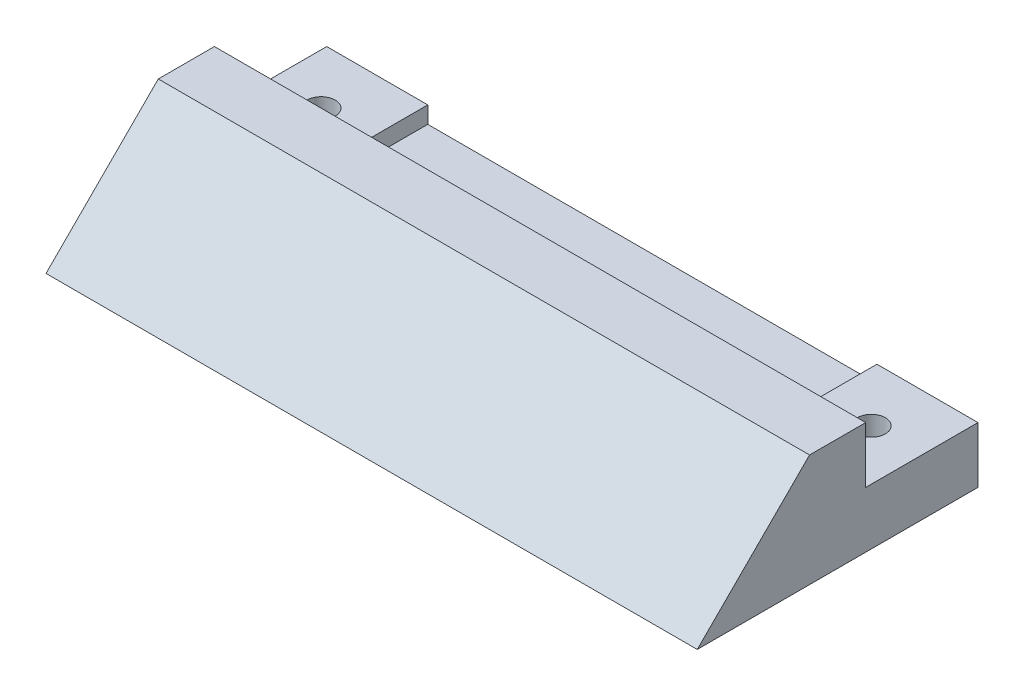
ISO-10303-21;
HEADER;
FILE_DESCRIPTION(('STEP AP214'),'2;1');
FILE_NAME('part.step','',(''),(''),'','','');
FILE_SCHEMA(('AUTOMOTIVE_DESIGN { 1 0 10303 214 1 1 1 1 }'));
ENDSEC;
DATA;
#1=APPLICATION_CONTEXT('core data for automotive mechanical design processes');
#2=APPLICATION_PROTOCOL_DEFINITION('international standard','automotive_design',2000,#1);
#3=PRODUCT_CONTEXT('',#1,'mechanical');
#4=PRODUCT('Part','Part','',(#3));
#5=PRODUCT_RELATED_PRODUCT_CATEGORY('part','',(#4));
#6=PRODUCT_DEFINITION_FORMATION('','',#4);
#7=PRODUCT_DEFINITION_CONTEXT('part definition',#1,'design');
#8=PRODUCT_DEFINITION('design','',#6,#7);
#9=PRODUCT_DEFINITION_SHAPE('','',#8);
#10=(LENGTH_UNIT() NAMED_UNIT(*) SI_UNIT(.MILLI.,.METRE.));
#11=(NAMED_UNIT(*) PLANE_ANGLE_UNIT() SI_UNIT($,.RADIAN.));
#12=(NAMED_UNIT(*) SI_UNIT($,.STERADIAN.) SOLID_ANGLE_UNIT());
#13=UNCERTAINTY_MEASURE_WITH_UNIT(LENGTH_MEASURE(1.E-05),#10,'distance_accuracy_value','');
#14=(GEOMETRIC_REPRESENTATION_CONTEXT(3) GLOBAL_UNCERTAINTY_ASSIGNED_CONTEXT((#13)) GLOBAL_UNIT_ASSIGNED_CONTEXT((#10,
#11,#12)) REPRESENTATION_CONTEXT('',''));
#15=CARTESIAN_POINT('',(0.,0.,0.));
#16=DIRECTION('',(0.,0.,1.));
#17=DIRECTION('',(1.,0.,0.));
#18=AXIS2_PLACEMENT_3D('',#15,#16,#17);
#19=CARTESIAN_POINT('',(58.,10.,-25.0000000000001));
#20=DIRECTION('',(0.,0.,1.));
#21=DIRECTION('',(0.,-1.,0.));
#22=AXIS2_PLACEMENT_3D('',#19,#20,#21);
#23=PLANE('',#22);
#24=DIRECTION('',(1.,0.,0.));
#25=VECTOR('',#24,1.);
#26=CARTESIAN_POINT('',(0.,5.,-25.0000000000001));
#27=LINE('',#26,#25);
#28=CARTESIAN_POINT('',(49.,5.,-25.0000000000001));
#29=VERTEX_POINT('',#28);
#30=CARTESIAN_POINT('',(58.,5.,-25.0000000000001));
#31=VERTEX_POINT('',#30);
#32=EDGE_CURVE('E232',#29,#31,#27,.T.);
#33=ORIENTED_EDGE('',*,*,#32,.T.);
#34=DIRECTION('',(0.,1.,0.));
#35=VECTOR('',#34,1.);
#36=CARTESIAN_POINT('',(58.,10.,-25.0000000000001));
#37=LINE('',#36,#35);
#38=CARTESIAN_POINT('',(58.,0.,-25.0000000000001));
#39=VERTEX_POINT('',#38);
#40=EDGE_CURVE('E218',#39,#31,#37,.T.);
#41=ORIENTED_EDGE('',*,*,#40,.F.);
#42=DIRECTION('',(-1.,0.,0.));
#43=VECTOR('',#42,1.);
#44=CARTESIAN_POINT('',(58.,0.,-25.0000000000001));
#45=LINE('',#44,#43);
#46=CARTESIAN_POINT('',(0.,0.,-25.0000000000001));
#47=VERTEX_POINT('',#46);
#48=EDGE_CURVE('E165',#39,#47,#45,.T.);
#49=ORIENTED_EDGE('',*,*,#48,.T.);
#50=DIRECTION('',(0.,1.,0.));
#51=VECTOR('',#50,1.);
#52=CARTESIAN_POINT('',(0.,10.,-25.0000000000001));
#53=LINE('',#52,#51);
#54=CARTESIAN_POINT('',(0.,5.,-25.0000000000001));
#55=VERTEX_POINT('',#54);
#56=EDGE_CURVE('E150',#47,#55,#53,.T.);
#57=ORIENTED_EDGE('',*,*,#56,.T.);
#58=CARTESIAN_POINT('',(9.,5.,-25.0000000000001));
#59=VERTEX_POINT('',#58);
#60=EDGE_CURVE('E425',#55,#59,#27,.T.);
#61=ORIENTED_EDGE('',*,*,#60,.T.);
#62=DIRECTION('',(0.,1.,0.));
#63=VECTOR('',#62,1.);
#64=CARTESIAN_POINT('',(9.,3.5,-25.0000000000001));
#65=LINE('',#64,#63);
#66=CARTESIAN_POINT('',(9.,3.5,-25.0000000000001));
#67=VERTEX_POINT('',#66);
#68=EDGE_CURVE('E211',#67,#59,#65,.T.);
#69=ORIENTED_EDGE('',*,*,#68,.F.);
#70=DIRECTION('',(-1.,0.,0.));
#71=VECTOR('',#70,1.);
#72=CARTESIAN_POINT('',(9.,3.5,-25.0000000000001));
#73=LINE('',#72,#71);
#74=CARTESIAN_POINT('',(49.,3.5,-25.0000000000001));
#75=VERTEX_POINT('',#74);
#76=EDGE_CURVE('E203',#75,#67,#73,.T.);
#77=ORIENTED_EDGE('',*,*,#76,.F.);
#78=DIRECTION('',(0.,1.,0.));
#79=VECTOR('',#78,1.);
#80=CARTESIAN_POINT('',(49.,3.5,-25.0000000000001));
#81=LINE('',#80,#79);
#82=EDGE_CURVE('E209',#75,#29,#81,.T.);
#83=ORIENTED_EDGE('',*,*,#82,.T.);
#84=EDGE_LOOP('',(#33,#41,#49,#57,#61,#69,#77,#83));
#85=FACE_BOUND('',#84,.T.);
#86=ADVANCED_FACE('F36',(#85),#23,.F.);
#87=CARTESIAN_POINT('',(9.,3.5,-25.0000000000001));
#88=DIRECTION('',(-1.,0.,0.));
#89=DIRECTION('',(0.,0.,1.));
#90=AXIS2_PLACEMENT_3D('',#87,#88,#89);
#91=PLANE('',#90);
#92=DIRECTION('',(0.,0.,-1.));
#93=VECTOR('',#92,1.);
#94=CARTESIAN_POINT('',(9.,5.,-25.0000000000001));
#95=LINE('',#94,#93);
#96=CARTESIAN_POINT('',(9.,5.,-18.0000000000001));
#97=VERTEX_POINT('',#96);
#98=EDGE_CURVE('E431',#97,#59,#95,.T.);
#99=ORIENTED_EDGE('',*,*,#98,.F.);
#100=DIRECTION('',(0.,1.,0.));
#101=VECTOR('',#100,1.);
#102=CARTESIAN_POINT('',(9.,3.5,-18.0000000000001));
#103=LINE('',#102,#101);
#104=CARTESIAN_POINT('',(9.,3.5,-18.0000000000001));
#105=VERTEX_POINT('',#104);
#106=EDGE_CURVE('E56',#97,#105,#103,.F.);
#107=ORIENTED_EDGE('',*,*,#106,.T.);
#108=DIRECTION('',(0.,0.,1.));
#109=VECTOR('',#108,1.);
#110=CARTESIAN_POINT('',(9.,3.5,-25.0000000000001));
#111=LINE('',#110,#109);
#112=EDGE_CURVE('E132',#67,#105,#111,.T.);
#113=ORIENTED_EDGE('',*,*,#112,.F.);
#114=ORIENTED_EDGE('',*,*,#68,.T.);
#115=EDGE_LOOP('',(#99,#107,#113,#114));
#116=FACE_BOUND('',#115,.T.);
#117=ADVANCED_FACE('F248',(#116),#91,.F.);
#118=CARTESIAN_POINT('',(49.,3.5,-25.0000000000001));
#119=DIRECTION('',(1.,0.,0.));
#120=DIRECTION('',(0.,0.,-1.));
#121=AXIS2_PLACEMENT_3D('',#118,#119,#120);
#122=PLANE('',#121);
#123=DIRECTION('',(0.,0.,-1.));
#124=VECTOR('',#123,1.);
#125=CARTESIAN_POINT('',(49.,3.5,-25.0000000000001));
#126=LINE('',#125,#124);
#127=CARTESIAN_POINT('',(49.,3.5,-18.0000000000001));
#128=VERTEX_POINT('',#127);
#129=EDGE_CURVE('E201',#128,#75,#126,.T.);
#130=ORIENTED_EDGE('',*,*,#129,.F.);
#131=DIRECTION('',(0.,1.,0.));
#132=VECTOR('',#131,1.);
#133=CARTESIAN_POINT('',(49.,5.,-18.0000000000001));
#134=LINE('',#133,#132);
#135=CARTESIAN_POINT('',(49.,5.,-18.0000000000001));
#136=VERTEX_POINT('',#135);
#137=EDGE_CURVE('E168',#128,#136,#134,.T.);
#138=ORIENTED_EDGE('',*,*,#137,.T.);
#139=DIRECTION('',(0.,0.,1.));
#140=VECTOR('',#139,1.);
#141=CARTESIAN_POINT('',(49.,5.,-25.0000000000001));
#142=LINE('',#141,#140);
#143=EDGE_CURVE('E188',#29,#136,#142,.T.);
#144=ORIENTED_EDGE('',*,*,#143,.F.);
#145=ORIENTED_EDGE('',*,*,#82,.F.);
#146=EDGE_LOOP('',(#130,#138,#144,#145));
#147=FACE_BOUND('',#146,.T.);
#148=ADVANCED_FACE('F253',(#147),#122,.F.);
#149=CARTESIAN_POINT('',(58.,0.,-25.0000000000001));
#150=DIRECTION('',(0.,1.,0.));
#151=DIRECTION('',(0.,0.,1.));
#152=AXIS2_PLACEMENT_3D('',#149,#150,#151);
#153=PLANE('',#152);
#154=CARTESIAN_POINT('',(53.5,0.,-20.0000000000001));
#155=DIRECTION('',(0.,1.,0.));
#156=DIRECTION('',(0.,0.,1.));
#157=AXIS2_PLACEMENT_3D('',#154,#155,#156);
#158=CIRCLE('',#157,1.25);
#159=CARTESIAN_POINT('',(53.5,0.,-18.7500000000001));
#160=VERTEX_POINT('',#159);
#161=EDGE_CURVE('E413',#160,#160,#158,.F.);
#162=ORIENTED_EDGE('',*,*,#161,.F.);
#163=EDGE_LOOP('',(#162));
#164=FACE_BOUND('',#163,.T.);
#165=CARTESIAN_POINT('',(4.5,0.,-20.0000000000001));
#166=DIRECTION('',(0.,1.,0.));
#167=DIRECTION('',(0.,0.,1.));
#168=AXIS2_PLACEMENT_3D('',#165,#166,#167);
#169=CIRCLE('',#168,1.25);
#170=CARTESIAN_POINT('',(4.5,0.,-18.7500000000001));
#171=VERTEX_POINT('',#170);
#172=EDGE_CURVE('E144',#171,#171,#169,.F.);
#173=ORIENTED_EDGE('',*,*,#172,.F.);
#174=EDGE_LOOP('',(#173));
#175=FACE_BOUND('',#174,.T.);
#176=CARTESIAN_POINT('',(44.,0.,-20.0000000000001));
#177=DIRECTION('',(0.,1.,0.));
#178=DIRECTION('',(0.,0.,1.));
#179=AXIS2_PLACEMENT_3D('',#176,#177,#178);
#180=CIRCLE('',#179,1.25);
#181=CARTESIAN_POINT('',(44.,0.,-18.7500000000001));
#182=VERTEX_POINT('',#181);
#183=EDGE_CURVE('E436',#182,#182,#180,.F.);
#184=ORIENTED_EDGE('',*,*,#183,.F.);
#185=EDGE_LOOP('',(#184));
#186=FACE_BOUND('',#185,.T.);
#187=CARTESIAN_POINT('',(29.,0.,-20.0000000000001));
#188=DIRECTION('',(0.,1.,0.));
#189=DIRECTION('',(0.,0.,1.));
#190=AXIS2_PLACEMENT_3D('',#187,#188,#189);
#191=CIRCLE('',#190,1.25);
#192=CARTESIAN_POINT('',(29.,0.,-18.7500000000001));
#193=VERTEX_POINT('',#192);
#194=EDGE_CURVE('E442',#193,#193,#191,.F.);
#195=ORIENTED_EDGE('',*,*,#194,.F.);
#196=EDGE_LOOP('',(#195));
#197=FACE_BOUND('',#196,.T.);
#198=CARTESIAN_POINT('',(14.,0.,-20.0000000000001));
#199=DIRECTION('',(0.,1.,0.));
#200=DIRECTION('',(0.,0.,1.));
#201=AXIS2_PLACEMENT_3D('',#198,#199,#200);
#202=CIRCLE('',#201,1.25);
#203=CARTESIAN_POINT('',(14.,0.,-18.7500000000001));
#204=VERTEX_POINT('',#203);
#205=EDGE_CURVE('E133',#204,#204,#202,.F.);
#206=ORIENTED_EDGE('',*,*,#205,.F.);
#207=EDGE_LOOP('',(#206));
#208=FACE_BOUND('',#207,.T.);
#209=DIRECTION('',(0.,0.,-1.));
#210=VECTOR('',#209,1.);
#211=CARTESIAN_POINT('',(0.,0.,-25.0000000000001));
#212=LINE('',#211,#210);
#213=CARTESIAN_POINT('',(0.,0.,0.));
#214=VERTEX_POINT('',#213);
#215=EDGE_CURVE('E155',#214,#47,#212,.T.);
#216=ORIENTED_EDGE('',*,*,#215,.T.);
#217=ORIENTED_EDGE('',*,*,#48,.F.);
#218=DIRECTION('',(0.,0.,-1.));
#219=VECTOR('',#218,1.);
#220=CARTESIAN_POINT('',(58.,0.,-25.0000000000001));
#221=LINE('',#220,#219);
#222=CARTESIAN_POINT('',(58.,0.,0.));
#223=VERTEX_POINT('',#222);
#224=EDGE_CURVE('E152',#223,#39,#221,.T.);
#225=ORIENTED_EDGE('',*,*,#224,.F.);
#226=DIRECTION('',(-1.,0.,0.));
#227=VECTOR('',#226,1.);
#228=CARTESIAN_POINT('',(58.,0.,0.));
#229=LINE('',#228,#227);
#230=EDGE_CURVE('E159',#223,#214,#229,.T.);
#231=ORIENTED_EDGE('',*,*,#230,.T.);
#232=EDGE_LOOP('',(#216,#217,#225,#231));
#233=FACE_BOUND('',#232,.T.);
#234=ADVANCED_FACE('F225',(#164,#175,#186,#197,#208,#233),#153,.F.);
#235=CARTESIAN_POINT('',(58.,10.,-10.0000000000001));
#236=DIRECTION('',(0.,-1.,0.));
#237=DIRECTION('',(0.,0.,-1.));
#238=AXIS2_PLACEMENT_3D('',#235,#236,#237);
#239=PLANE('',#238);
#240=DIRECTION('',(0.,0.,1.));
#241=VECTOR('',#240,1.);
#242=CARTESIAN_POINT('',(58.,10.,-10.0000000000001));
#243=LINE('',#242,#241);
#244=CARTESIAN_POINT('',(58.,10.,-15.0000000000001));
#245=VERTEX_POINT('',#244);
#246=CARTESIAN_POINT('',(58.,10.,-10.0000000000001));
#247=VERTEX_POINT('',#246);
#248=EDGE_CURVE('E129',#245,#247,#243,.T.);
#249=ORIENTED_EDGE('',*,*,#248,.F.);
#250=DIRECTION('',(1.,0.,0.));
#251=VECTOR('',#250,1.);
#252=CARTESIAN_POINT('',(9.,10.,-15.0000000000001));
#253=LINE('',#252,#251);
#254=CARTESIAN_POINT('',(0.,10.,-15.0000000000001));
#255=VERTEX_POINT('',#254);
#256=EDGE_CURVE('E122',#255,#245,#253,.T.);
#257=ORIENTED_EDGE('',*,*,#256,.F.);
#258=DIRECTION('',(0.,0.,1.));
#259=VECTOR('',#258,1.);
#260=CARTESIAN_POINT('',(0.,10.,-10.0000000000001));
#261=LINE('',#260,#259);
#262=CARTESIAN_POINT('',(0.,10.,-10.0000000000001));
#263=VERTEX_POINT('',#262);
#264=EDGE_CURVE('E127',#255,#263,#261,.T.);
#265=ORIENTED_EDGE('',*,*,#264,.T.);
#266=DIRECTION('',(-1.,0.,0.));
#267=VECTOR('',#266,1.);
#268=CARTESIAN_POINT('',(58.,10.,-10.0000000000001));
#269=LINE('',#268,#267);
#270=EDGE_CURVE('E162',#247,#263,#269,.T.);
#271=ORIENTED_EDGE('',*,*,#270,.F.);
#272=EDGE_LOOP('',(#249,#257,#265,#271));
#273=FACE_BOUND('',#272,.T.);
#274=ADVANCED_FACE('F124',(#273),#239,.F.);
#275=CARTESIAN_POINT('',(58.,0.,0.));
#276=DIRECTION('',(0.,-0.707106781186551,-0.707106781186544));
#277=DIRECTION('',(0.,0.707106781186544,-0.707106781186551));
#278=AXIS2_PLACEMENT_3D('',#275,#276,#277);
#279=PLANE('',#278);
#280=DIRECTION('',(0.,-0.707106781186544,0.707106781186551));
#281=VECTOR('',#280,1.);
#282=CARTESIAN_POINT('',(0.,0.,0.));
#283=LINE('',#282,#281);
#284=EDGE_CURVE('E149',#263,#214,#283,.T.);
#285=ORIENTED_EDGE('',*,*,#284,.T.);
#286=ORIENTED_EDGE('',*,*,#230,.F.);
#287=DIRECTION('',(0.,-0.707106781186544,0.707106781186551));
#288=VECTOR('',#287,1.);
#289=CARTESIAN_POINT('',(58.,0.,0.));
#290=LINE('',#289,#288);
#291=EDGE_CURVE('E163',#247,#223,#290,.T.);
#292=ORIENTED_EDGE('',*,*,#291,.F.);
#293=ORIENTED_EDGE('',*,*,#270,.T.);
#294=EDGE_LOOP('',(#285,#286,#292,#293));
#295=FACE_BOUND('',#294,.T.);
#296=ADVANCED_FACE('F237',(#295),#279,.F.);
#297=CARTESIAN_POINT('',(58.,0.,0.));
#298=DIRECTION('',(1.,0.,0.));
#299=DIRECTION('',(0.,0.,-1.));
#300=AXIS2_PLACEMENT_3D('',#297,#298,#299);
#301=PLANE('',#300);
#302=DIRECTION('',(0.,1.,0.));
#303=VECTOR('',#302,1.);
#304=CARTESIAN_POINT('',(58.,-55.3557558782486,-15.0000000000001));
#305=LINE('',#304,#303);
#306=CARTESIAN_POINT('',(58.,5.,-15.0000000000001));
#307=VERTEX_POINT('',#306);
#308=EDGE_CURVE('E143',#307,#245,#305,.T.);
#309=ORIENTED_EDGE('',*,*,#308,.T.);
#310=ORIENTED_EDGE('',*,*,#248,.T.);
#311=ORIENTED_EDGE('',*,*,#291,.T.);
#312=ORIENTED_EDGE('',*,*,#224,.T.);
#313=ORIENTED_EDGE('',*,*,#40,.T.);
#314=DIRECTION('',(0.,0.,1.));
#315=VECTOR('',#314,1.);
#316=CARTESIAN_POINT('',(58.,5.,-25.0000000000001));
#317=LINE('',#316,#315);
#318=EDGE_CURVE('E423',#31,#307,#317,.T.);
#319=ORIENTED_EDGE('',*,*,#318,.T.);
#320=EDGE_LOOP('',(#309,#310,#311,#312,#313,#319));
#321=FACE_BOUND('',#320,.T.);
#322=ADVANCED_FACE('F234',(#321),#301,.T.);
#323=CARTESIAN_POINT('',(0.,0.,0.));
#324=DIRECTION('',(1.,0.,0.));
#325=DIRECTION('',(0.,0.,-1.));
#326=AXIS2_PLACEMENT_3D('',#323,#324,#325);
#327=PLANE('',#326);
#328=ORIENTED_EDGE('',*,*,#264,.F.);
#329=DIRECTION('',(0.,1.,0.));
#330=VECTOR('',#329,1.);
#331=CARTESIAN_POINT('',(0.,-55.3557558782486,-15.0000000000001));
#332=LINE('',#331,#330);
#333=CARTESIAN_POINT('',(0.,5.,-15.0000000000001));
#334=VERTEX_POINT('',#333);
#335=EDGE_CURVE('E136',#334,#255,#332,.T.);
#336=ORIENTED_EDGE('',*,*,#335,.F.);
#337=DIRECTION('',(0.,0.,-1.));
#338=VECTOR('',#337,1.);
#339=CARTESIAN_POINT('',(0.,5.,-25.0000000000001));
#340=LINE('',#339,#338);
#341=EDGE_CURVE('E228',#334,#55,#340,.T.);
#342=ORIENTED_EDGE('',*,*,#341,.T.);
#343=ORIENTED_EDGE('',*,*,#56,.F.);
#344=ORIENTED_EDGE('',*,*,#215,.F.);
#345=ORIENTED_EDGE('',*,*,#284,.F.);
#346=EDGE_LOOP('',(#328,#336,#342,#343,#344,#345));
#347=FACE_BOUND('',#346,.T.);
#348=ADVANCED_FACE('F147',(#347),#327,.F.);
#349=CARTESIAN_POINT('',(9.,3.5,-15.0000000000001));
#350=DIRECTION('',(0.,0.,1.));
#351=DIRECTION('',(1.,0.,0.));
#352=AXIS2_PLACEMENT_3D('',#349,#350,#351);
#353=PLANE('',#352);
#354=DIRECTION('',(-1.,0.,0.));
#355=VECTOR('',#354,1.);
#356=CARTESIAN_POINT('',(0.,5.,-15.0000000000001));
#357=LINE('',#356,#355);
#358=CARTESIAN_POINT('',(46.,5.,-15.0000000000001));
#359=VERTEX_POINT('',#358);
#360=EDGE_CURVE('E185',#307,#359,#357,.T.);
#361=ORIENTED_EDGE('',*,*,#360,.T.);
#362=DIRECTION('',(0.,1.,0.));
#363=VECTOR('',#362,1.);
#364=CARTESIAN_POINT('',(46.,3.5,-15.0000000000001));
#365=LINE('',#364,#363);
#366=CARTESIAN_POINT('',(46.,3.5,-15.0000000000001));
#367=VERTEX_POINT('',#366);
#368=EDGE_CURVE('E173',#359,#367,#365,.F.);
#369=ORIENTED_EDGE('',*,*,#368,.T.);
#370=DIRECTION('',(1.,0.,0.));
#371=VECTOR('',#370,1.);
#372=CARTESIAN_POINT('',(9.,3.5,-15.0000000000001));
#373=LINE('',#372,#371);
#374=CARTESIAN_POINT('',(12.,3.5,-15.0000000000001));
#375=VERTEX_POINT('',#374);
#376=EDGE_CURVE('E195',#375,#367,#373,.T.);
#377=ORIENTED_EDGE('',*,*,#376,.F.);
#378=DIRECTION('',(0.,1.,0.));
#379=VECTOR('',#378,1.);
#380=CARTESIAN_POINT('',(12.,5.,-15.0000000000001));
#381=LINE('',#380,#379);
#382=CARTESIAN_POINT('',(12.,5.,-15.0000000000001));
#383=VERTEX_POINT('',#382);
#384=EDGE_CURVE('E171',#375,#383,#381,.T.);
#385=ORIENTED_EDGE('',*,*,#384,.T.);
#386=EDGE_CURVE('E139',#383,#334,#357,.T.);
#387=ORIENTED_EDGE('',*,*,#386,.T.);
#388=ORIENTED_EDGE('',*,*,#335,.T.);
#389=ORIENTED_EDGE('',*,*,#256,.T.);
#390=ORIENTED_EDGE('',*,*,#308,.F.);
#391=EDGE_LOOP('',(#361,#369,#377,#385,#387,#388,#389,#390));
#392=FACE_BOUND('',#391,.T.);
#393=ADVANCED_FACE('F137',(#392),#353,.F.);
#394=CARTESIAN_POINT('',(0.,3.5,0.));
#395=DIRECTION('',(0.,1.,0.));
#396=DIRECTION('',(0.,0.,1.));
#397=AXIS2_PLACEMENT_3D('',#394,#395,#396);
#398=PLANE('',#397);
#399=CARTESIAN_POINT('',(44.,3.5,-20.0000000000001));
#400=DIRECTION('',(0.,1.,0.));
#401=DIRECTION('',(0.,0.,1.));
#402=AXIS2_PLACEMENT_3D('',#399,#400,#401);
#403=CIRCLE('',#402,1.25);
#404=CARTESIAN_POINT('',(44.,3.5,-18.7500000000001));
#405=VERTEX_POINT('',#404);
#406=EDGE_CURVE('E433',#405,#405,#403,.T.);
#407=ORIENTED_EDGE('',*,*,#406,.F.);
#408=EDGE_LOOP('',(#407));
#409=FACE_BOUND('',#408,.T.);
#410=CARTESIAN_POINT('',(29.,3.5,-20.0000000000001));
#411=DIRECTION('',(0.,1.,0.));
#412=DIRECTION('',(0.,0.,1.));
#413=AXIS2_PLACEMENT_3D('',#410,#411,#412);
#414=CIRCLE('',#413,1.25);
#415=CARTESIAN_POINT('',(29.,3.5,-18.7500000000001));
#416=VERTEX_POINT('',#415);
#417=EDGE_CURVE('E439',#416,#416,#414,.T.);
#418=ORIENTED_EDGE('',*,*,#417,.F.);
#419=EDGE_LOOP('',(#418));
#420=FACE_BOUND('',#419,.T.);
#421=CARTESIAN_POINT('',(14.,3.5,-20.0000000000001));
#422=DIRECTION('',(0.,1.,0.));
#423=DIRECTION('',(0.,0.,1.));
#424=AXIS2_PLACEMENT_3D('',#421,#422,#423);
#425=CIRCLE('',#424,1.25);
#426=CARTESIAN_POINT('',(14.,3.5,-18.7500000000001));
#427=VERTEX_POINT('',#426);
#428=EDGE_CURVE('E445',#427,#427,#425,.T.);
#429=ORIENTED_EDGE('',*,*,#428,.F.);
#430=EDGE_LOOP('',(#429));
#431=FACE_BOUND('',#430,.T.);
#432=ORIENTED_EDGE('',*,*,#376,.T.);
#433=CARTESIAN_POINT('',(46.,3.5,-18.0000000000001));
#434=DIRECTION('',(0.,1.,0.));
#435=DIRECTION('',(0.,0.,1.));
#436=AXIS2_PLACEMENT_3D('',#433,#434,#435);
#437=CIRCLE('',#436,3.);
#438=EDGE_CURVE('E177',#367,#128,#437,.T.);
#439=ORIENTED_EDGE('',*,*,#438,.T.);
#440=ORIENTED_EDGE('',*,*,#129,.T.);
#441=ORIENTED_EDGE('',*,*,#76,.T.);
#442=ORIENTED_EDGE('',*,*,#112,.T.);
#443=CARTESIAN_POINT('',(12.,3.5,-18.0000000000001));
#444=DIRECTION('',(0.,1.,0.));
#445=DIRECTION('',(0.,0.,1.));
#446=AXIS2_PLACEMENT_3D('',#443,#444,#445);
#447=CIRCLE('',#446,3.);
#448=EDGE_CURVE('E175',#105,#375,#447,.T.);
#449=ORIENTED_EDGE('',*,*,#448,.T.);
#450=EDGE_LOOP('',(#432,#439,#440,#441,#442,#449));
#451=FACE_BOUND('',#450,.T.);
#452=ADVANCED_FACE('F198',(#409,#420,#431,#451),#398,.T.);
#453=CARTESIAN_POINT('',(14.,-0.00100000000000187,-20.0000000000001));
#454=DIRECTION('',(0.,1.,0.));
#455=DIRECTION('',(0.,0.,1.));
#456=AXIS2_PLACEMENT_3D('',#453,#454,#455);
#457=CYLINDRICAL_SURFACE('',#456,1.25);
#458=ORIENTED_EDGE('',*,*,#428,.T.);
#459=EDGE_LOOP('',(#458));
#460=FACE_BOUND('',#459,.T.);
#461=ORIENTED_EDGE('',*,*,#205,.T.);
#462=EDGE_LOOP('',(#461));
#463=FACE_BOUND('',#462,.T.);
#464=ADVANCED_FACE('F287',(#460,#463),#457,.F.);
#465=CARTESIAN_POINT('',(29.,-0.00100000000000187,-20.0000000000001));
#466=DIRECTION('',(0.,1.,0.));
#467=DIRECTION('',(0.,0.,1.));
#468=AXIS2_PLACEMENT_3D('',#465,#466,#467);
#469=CYLINDRICAL_SURFACE('',#468,1.25);
#470=ORIENTED_EDGE('',*,*,#417,.T.);
#471=EDGE_LOOP('',(#470));
#472=FACE_BOUND('',#471,.T.);
#473=ORIENTED_EDGE('',*,*,#194,.T.);
#474=EDGE_LOOP('',(#473));
#475=FACE_BOUND('',#474,.T.);
#476=ADVANCED_FACE('F283',(#472,#475),#469,.F.);
#477=CARTESIAN_POINT('',(44.,-0.00100000000000187,-20.0000000000001));
#478=DIRECTION('',(0.,1.,0.));
#479=DIRECTION('',(0.,0.,1.));
#480=AXIS2_PLACEMENT_3D('',#477,#478,#479);
#481=CYLINDRICAL_SURFACE('',#480,1.25);
#482=ORIENTED_EDGE('',*,*,#406,.T.);
#483=EDGE_LOOP('',(#482));
#484=FACE_BOUND('',#483,.T.);
#485=ORIENTED_EDGE('',*,*,#183,.T.);
#486=EDGE_LOOP('',(#485));
#487=FACE_BOUND('',#486,.T.);
#488=ADVANCED_FACE('F280',(#484,#487),#481,.F.);
#489=CARTESIAN_POINT('',(0.,5.,0.));
#490=DIRECTION('',(0.,1.,0.));
#491=DIRECTION('',(0.,0.,1.));
#492=AXIS2_PLACEMENT_3D('',#489,#490,#491);
#493=PLANE('',#492);
#494=CARTESIAN_POINT('',(53.5,5.,-20.0000000000001));
#495=DIRECTION('',(0.,1.,0.));
#496=DIRECTION('',(0.,0.,1.));
#497=AXIS2_PLACEMENT_3D('',#494,#495,#496);
#498=CIRCLE('',#497,1.25);
#499=CARTESIAN_POINT('',(53.5,5.,-18.7500000000001));
#500=VERTEX_POINT('',#499);
#501=EDGE_CURVE('E412',#500,#500,#498,.T.);
#502=ORIENTED_EDGE('',*,*,#501,.F.);
#503=EDGE_LOOP('',(#502));
#504=FACE_BOUND('',#503,.T.);
#505=ORIENTED_EDGE('',*,*,#143,.T.);
#506=CARTESIAN_POINT('',(46.,5.,-18.0000000000001));
#507=DIRECTION('',(0.,1.,0.));
#508=DIRECTION('',(0.,0.,1.));
#509=AXIS2_PLACEMENT_3D('',#506,#507,#508);
#510=CIRCLE('',#509,3.);
#511=EDGE_CURVE('E44',#136,#359,#510,.F.);
#512=ORIENTED_EDGE('',*,*,#511,.T.);
#513=ORIENTED_EDGE('',*,*,#360,.F.);
#514=ORIENTED_EDGE('',*,*,#318,.F.);
#515=ORIENTED_EDGE('',*,*,#32,.F.);
#516=EDGE_LOOP('',(#505,#512,#513,#514,#515));
#517=FACE_BOUND('',#516,.T.);
#518=ADVANCED_FACE('F184',(#504,#517),#493,.T.);
#519=CARTESIAN_POINT('',(4.5,5.,-20.0000000000001));
#520=DIRECTION('',(0.,1.,0.));
#521=DIRECTION('',(0.,0.,1.));
#522=AXIS2_PLACEMENT_3D('',#519,#520,#521);
#523=CIRCLE('',#522,1.25);
#524=CARTESIAN_POINT('',(4.5,5.,-18.7500000000001));
#525=VERTEX_POINT('',#524);
#526=EDGE_CURVE('E416',#525,#525,#523,.T.);
#527=ORIENTED_EDGE('',*,*,#526,.F.);
#528=EDGE_LOOP('',(#527));
#529=FACE_BOUND('',#528,.T.);
#530=ORIENTED_EDGE('',*,*,#386,.F.);
#531=CARTESIAN_POINT('',(12.,5.,-18.0000000000001));
#532=DIRECTION('',(0.,1.,0.));
#533=DIRECTION('',(0.,0.,1.));
#534=AXIS2_PLACEMENT_3D('',#531,#532,#533);
#535=CIRCLE('',#534,3.);
#536=EDGE_CURVE('E13',#383,#97,#535,.F.);
#537=ORIENTED_EDGE('',*,*,#536,.T.);
#538=ORIENTED_EDGE('',*,*,#98,.T.);
#539=ORIENTED_EDGE('',*,*,#60,.F.);
#540=ORIENTED_EDGE('',*,*,#341,.F.);
#541=EDGE_LOOP('',(#530,#537,#538,#539,#540));
#542=FACE_BOUND('',#541,.T.);
#543=ADVANCED_FACE('F271',(#529,#542),#493,.T.);
#544=CARTESIAN_POINT('',(4.5,-0.00100000000000187,-20.0000000000001));
#545=DIRECTION('',(0.,1.,0.));
#546=DIRECTION('',(0.,0.,1.));
#547=AXIS2_PLACEMENT_3D('',#544,#545,#546);
#548=CYLINDRICAL_SURFACE('',#547,1.25);
#549=ORIENTED_EDGE('',*,*,#526,.T.);
#550=EDGE_LOOP('',(#549));
#551=FACE_BOUND('',#550,.T.);
#552=ORIENTED_EDGE('',*,*,#172,.T.);
#553=EDGE_LOOP('',(#552));
#554=FACE_BOUND('',#553,.T.);
#555=ADVANCED_FACE('F265',(#551,#554),#548,.F.);
#556=CARTESIAN_POINT('',(53.5,-0.00100000000000187,-20.0000000000001));
#557=DIRECTION('',(0.,1.,0.));
#558=DIRECTION('',(0.,0.,1.));
#559=AXIS2_PLACEMENT_3D('',#556,#557,#558);
#560=CYLINDRICAL_SURFACE('',#559,1.25);
#561=ORIENTED_EDGE('',*,*,#501,.T.);
#562=EDGE_LOOP('',(#561));
#563=FACE_BOUND('',#562,.T.);
#564=ORIENTED_EDGE('',*,*,#161,.T.);
#565=EDGE_LOOP('',(#564));
#566=FACE_BOUND('',#565,.T.);
#567=ADVANCED_FACE('F259',(#563,#566),#560,.F.);
#568=CARTESIAN_POINT('',(46.,3.5,-18.0000000000001));
#569=DIRECTION('',(0.,-1.,0.));
#570=DIRECTION('',(0.,0.,-1.));
#571=AXIS2_PLACEMENT_3D('',#568,#569,#570);
#572=CYLINDRICAL_SURFACE('',#571,3.);
#573=ORIENTED_EDGE('',*,*,#438,.F.);
#574=ORIENTED_EDGE('',*,*,#368,.F.);
#575=ORIENTED_EDGE('',*,*,#511,.F.);
#576=ORIENTED_EDGE('',*,*,#137,.F.);
#577=EDGE_LOOP('',(#573,#574,#575,#576));
#578=FACE_BOUND('',#577,.T.);
#579=ADVANCED_FACE('F192',(#578),#572,.F.);
#580=CARTESIAN_POINT('',(12.,3.5,-18.0000000000001));
#581=DIRECTION('',(0.,-1.,0.));
#582=DIRECTION('',(0.,0.,-1.));
#583=AXIS2_PLACEMENT_3D('',#580,#581,#582);
#584=CYLINDRICAL_SURFACE('',#583,3.);
#585=ORIENTED_EDGE('',*,*,#448,.F.);
#586=ORIENTED_EDGE('',*,*,#106,.F.);
#587=ORIENTED_EDGE('',*,*,#536,.F.);
#588=ORIENTED_EDGE('',*,*,#384,.F.);
#589=EDGE_LOOP('',(#585,#586,#587,#588));
#590=FACE_BOUND('',#589,.T.);
#591=ADVANCED_FACE('F38',(#590),#584,.F.);
#592=CLOSED_SHELL('',(#86,#117,#148,#234,#274,#296,#322,#348,#393,#452,#464,#476,#488,#518,#543,
#555,#567,#579,#591));
#593=MANIFOLD_SOLID_BREP('B2',#592);
#594=ADVANCED_BREP_SHAPE_REPRESENTATION('',(#18,#593),#14);
#595=SHAPE_DEFINITION_REPRESENTATION(#9,#594);
ENDSEC;
END-ISO-10303-21;
